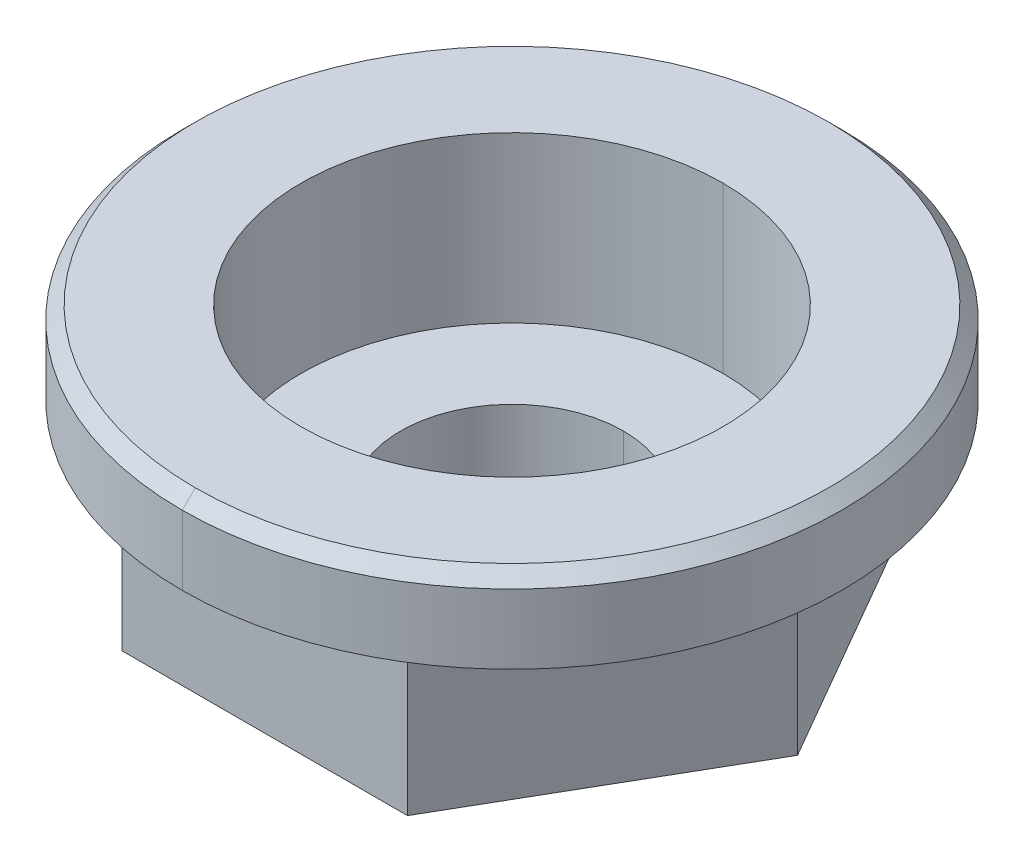
ISO-10303-21;
HEADER;
FILE_DESCRIPTION(('STEP AP214'),'2;1');
FILE_NAME('part.step','',(''),(''),'','','');
FILE_SCHEMA(('AUTOMOTIVE_DESIGN { 1 0 10303 214 1 1 1 1 }'));
ENDSEC;
DATA;
#1=APPLICATION_CONTEXT('core data for automotive mechanical design processes');
#2=APPLICATION_PROTOCOL_DEFINITION('international standard','automotive_design',2000,#1);
#3=PRODUCT_CONTEXT('',#1,'mechanical');
#4=PRODUCT('Part','Part','',(#3));
#5=PRODUCT_RELATED_PRODUCT_CATEGORY('part','',(#4));
#6=PRODUCT_DEFINITION_FORMATION('','',#4);
#7=PRODUCT_DEFINITION_CONTEXT('part definition',#1,'design');
#8=PRODUCT_DEFINITION('design','',#6,#7);
#9=PRODUCT_DEFINITION_SHAPE('','',#8);
#10=(LENGTH_UNIT() NAMED_UNIT(*) SI_UNIT(.MILLI.,.METRE.));
#11=(NAMED_UNIT(*) PLANE_ANGLE_UNIT() SI_UNIT($,.RADIAN.));
#12=(NAMED_UNIT(*) SI_UNIT($,.STERADIAN.) SOLID_ANGLE_UNIT());
#13=UNCERTAINTY_MEASURE_WITH_UNIT(LENGTH_MEASURE(1.E-05),#10,'distance_accuracy_value','');
#14=(GEOMETRIC_REPRESENTATION_CONTEXT(3) GLOBAL_UNCERTAINTY_ASSIGNED_CONTEXT((#13)) GLOBAL_UNIT_ASSIGNED_CONTEXT((#10,
#11,#12)) REPRESENTATION_CONTEXT('',''));
#15=CARTESIAN_POINT('',(0.,0.,0.));
#16=DIRECTION('',(0.,0.,1.));
#17=DIRECTION('',(1.,0.,0.));
#18=AXIS2_PLACEMENT_3D('',#15,#16,#17);
#19=CARTESIAN_POINT('',(0.,4.7625,0.));
#20=DIRECTION('',(0.,-1.,0.));
#21=DIRECTION('',(0.,0.,-1.));
#22=AXIS2_PLACEMENT_3D('',#19,#20,#21);
#23=CONICAL_SURFACE('',#22,6.1,0.78539816339745);
#24=DIRECTION('',(0.,-0.707106781186546,0.707106781186549));
#25=VECTOR('',#24,1.);
#26=CARTESIAN_POINT('',(0.,4.7625,6.1));
#27=LINE('',#26,#25);
#28=CARTESIAN_POINT('',(0.,4.7625,6.1));
#29=VERTEX_POINT('',#28);
#30=CARTESIAN_POINT('',(0.,4.5125,6.35));
#31=VERTEX_POINT('',#30);
#32=EDGE_CURVE('E220',#29,#31,#27,.T.);
#33=ORIENTED_EDGE('',*,*,#32,.F.);
#34=CARTESIAN_POINT('',(0.,4.7625,0.));
#35=DIRECTION('',(0.,1.,0.));
#36=DIRECTION('',(0.,0.,1.));
#37=AXIS2_PLACEMENT_3D('',#34,#35,#36);
#38=CIRCLE('',#37,6.1);
#39=CARTESIAN_POINT('',(0.,4.7625,-6.1));
#40=VERTEX_POINT('',#39);
#41=EDGE_CURVE('E179',#40,#29,#38,.T.);
#42=ORIENTED_EDGE('',*,*,#41,.F.);
#43=DIRECTION('',(0.,-0.707106781186546,-0.707106781186549));
#44=VECTOR('',#43,1.);
#45=CARTESIAN_POINT('',(0.,4.7625,-6.1));
#46=LINE('',#45,#44);
#47=CARTESIAN_POINT('',(0.,4.5125,-6.35));
#48=VERTEX_POINT('',#47);
#49=EDGE_CURVE('E166',#40,#48,#46,.T.);
#50=ORIENTED_EDGE('',*,*,#49,.T.);
#51=CARTESIAN_POINT('',(0.,4.5125,0.));
#52=DIRECTION('',(0.,-1.,0.));
#53=DIRECTION('',(0.,0.,1.));
#54=AXIS2_PLACEMENT_3D('',#51,#52,#53);
#55=CIRCLE('',#54,6.35);
#56=EDGE_CURVE('E176',#31,#48,#55,.T.);
#57=ORIENTED_EDGE('',*,*,#56,.F.);
#58=EDGE_LOOP('',(#33,#42,#50,#57));
#59=FACE_BOUND('',#58,.T.);
#60=ADVANCED_FACE('F16',(#59),#23,.T.);
#61=CARTESIAN_POINT('',(0.,0.,0.));
#62=DIRECTION('',(0.,1.,0.));
#63=DIRECTION('',(0.,0.,1.));
#64=AXIS2_PLACEMENT_3D('',#61,#62,#63);
#65=CYLINDRICAL_SURFACE('',#64,2.1463);
#66=DIRECTION('',(0.,1.,0.));
#67=VECTOR('',#66,1.);
#68=CARTESIAN_POINT('',(0.,0.,-2.1463));
#69=LINE('',#68,#67);
#70=CARTESIAN_POINT('',(0.,0.,-2.1463));
#71=VERTEX_POINT('',#70);
#72=CARTESIAN_POINT('',(0.,1.5875,-2.1463));
#73=VERTEX_POINT('',#72);
#74=EDGE_CURVE('E215',#71,#73,#69,.T.);
#75=ORIENTED_EDGE('',*,*,#74,.F.);
#76=CARTESIAN_POINT('',(0.,0.,0.));
#77=DIRECTION('',(0.,1.,0.));
#78=DIRECTION('',(0.,0.,1.));
#79=AXIS2_PLACEMENT_3D('',#76,#77,#78);
#80=CIRCLE('',#79,2.1463);
#81=CARTESIAN_POINT('',(0.,0.,2.1463));
#82=VERTEX_POINT('',#81);
#83=EDGE_CURVE('E205',#82,#71,#80,.T.);
#84=ORIENTED_EDGE('',*,*,#83,.F.);
#85=DIRECTION('',(0.,1.,0.));
#86=VECTOR('',#85,1.);
#87=CARTESIAN_POINT('',(0.,0.,2.1463));
#88=LINE('',#87,#86);
#89=CARTESIAN_POINT('',(0.,1.5875,2.1463));
#90=VERTEX_POINT('',#89);
#91=EDGE_CURVE('E198',#82,#90,#88,.T.);
#92=ORIENTED_EDGE('',*,*,#91,.T.);
#93=CARTESIAN_POINT('',(0.,1.5875,0.));
#94=DIRECTION('',(0.,1.,0.));
#95=DIRECTION('',(0.,0.,1.));
#96=AXIS2_PLACEMENT_3D('',#93,#94,#95);
#97=CIRCLE('',#96,2.1463);
#98=EDGE_CURVE('E11',#90,#73,#97,.T.);
#99=ORIENTED_EDGE('',*,*,#98,.T.);
#100=EDGE_LOOP('',(#75,#84,#92,#99));
#101=FACE_BOUND('',#100,.T.);
#102=ADVANCED_FACE('F329',(#101),#65,.F.);
#103=CARTESIAN_POINT('',(0.,1.5875,0.));
#104=DIRECTION('',(0.,1.,0.));
#105=DIRECTION('',(1.,0.,0.));
#106=AXIS2_PLACEMENT_3D('',#103,#104,#105);
#107=PLANE('',#106);
#108=ORIENTED_EDGE('',*,*,#98,.F.);
#109=CARTESIAN_POINT('',(0.,1.5875,0.));
#110=DIRECTION('',(0.,1.,0.));
#111=DIRECTION('',(0.,0.,1.));
#112=AXIS2_PLACEMENT_3D('',#109,#110,#111);
#113=CIRCLE('',#112,2.1463);
#114=EDGE_CURVE('E20',#73,#90,#113,.T.);
#115=ORIENTED_EDGE('',*,*,#114,.F.);
#116=EDGE_LOOP('',(#108,#115));
#117=FACE_BOUND('',#116,.T.);
#118=CARTESIAN_POINT('',(0.,1.5875,0.));
#119=DIRECTION('',(0.,-1.,0.));
#120=DIRECTION('',(0.,0.,1.));
#121=AXIS2_PLACEMENT_3D('',#118,#119,#120);
#122=CIRCLE('',#121,4.064);
#123=CARTESIAN_POINT('',(0.,1.5875,4.064));
#124=VERTEX_POINT('',#123);
#125=CARTESIAN_POINT('',(0.,1.5875,-4.064));
#126=VERTEX_POINT('',#125);
#127=EDGE_CURVE('E202',#124,#126,#122,.T.);
#128=ORIENTED_EDGE('',*,*,#127,.F.);
#129=CARTESIAN_POINT('',(0.,1.5875,0.));
#130=DIRECTION('',(0.,-1.,0.));
#131=DIRECTION('',(0.,0.,1.));
#132=AXIS2_PLACEMENT_3D('',#129,#130,#131);
#133=CIRCLE('',#132,4.064);
#134=EDGE_CURVE('E27',#126,#124,#133,.T.);
#135=ORIENTED_EDGE('',*,*,#134,.F.);
#136=EDGE_LOOP('',(#128,#135));
#137=FACE_BOUND('',#136,.T.);
#138=ADVANCED_FACE('F324',(#117,#137),#107,.T.);
#139=CARTESIAN_POINT('',(0.,-11.4947278349685,0.));
#140=DIRECTION('',(0.,1.,0.));
#141=DIRECTION('',(0.,0.,1.));
#142=AXIS2_PLACEMENT_3D('',#139,#140,#141);
#143=CYLINDRICAL_SURFACE('',#142,4.064);
#144=DIRECTION('',(0.,1.,0.));
#145=VECTOR('',#144,1.);
#146=CARTESIAN_POINT('',(0.,-11.4947278349685,-4.064));
#147=LINE('',#146,#145);
#148=CARTESIAN_POINT('',(0.,4.7625,-4.064));
#149=VERTEX_POINT('',#148);
#150=EDGE_CURVE('E211',#126,#149,#147,.T.);
#151=ORIENTED_EDGE('',*,*,#150,.F.);
#152=ORIENTED_EDGE('',*,*,#134,.T.);
#153=DIRECTION('',(0.,1.,0.));
#154=VECTOR('',#153,1.);
#155=CARTESIAN_POINT('',(0.,-11.4947278349685,4.064));
#156=LINE('',#155,#154);
#157=CARTESIAN_POINT('',(0.,4.7625,4.064));
#158=VERTEX_POINT('',#157);
#159=EDGE_CURVE('E151',#124,#158,#156,.T.);
#160=ORIENTED_EDGE('',*,*,#159,.T.);
#161=CARTESIAN_POINT('',(0.,4.7625,0.));
#162=DIRECTION('',(0.,1.,0.));
#163=DIRECTION('',(0.,0.,1.));
#164=AXIS2_PLACEMENT_3D('',#161,#162,#163);
#165=CIRCLE('',#164,4.064);
#166=EDGE_CURVE('E194',#158,#149,#165,.T.);
#167=ORIENTED_EDGE('',*,*,#166,.T.);
#168=EDGE_LOOP('',(#151,#152,#160,#167));
#169=FACE_BOUND('',#168,.T.);
#170=ADVANCED_FACE('F275',(#169),#143,.F.);
#171=CARTESIAN_POINT('',(0.,4.7625,0.));
#172=DIRECTION('',(0.,1.,0.));
#173=DIRECTION('',(1.,0.,0.));
#174=AXIS2_PLACEMENT_3D('',#171,#172,#173);
#175=PLANE('',#174);
#176=ORIENTED_EDGE('',*,*,#166,.F.);
#177=CARTESIAN_POINT('',(0.,4.7625,0.));
#178=DIRECTION('',(0.,1.,0.));
#179=DIRECTION('',(0.,0.,1.));
#180=AXIS2_PLACEMENT_3D('',#177,#178,#179);
#181=CIRCLE('',#180,4.064);
#182=EDGE_CURVE('E156',#149,#158,#181,.T.);
#183=ORIENTED_EDGE('',*,*,#182,.F.);
#184=EDGE_LOOP('',(#176,#183));
#185=FACE_BOUND('',#184,.T.);
#186=ORIENTED_EDGE('',*,*,#41,.T.);
#187=CARTESIAN_POINT('',(0.,4.7625,0.));
#188=DIRECTION('',(0.,1.,0.));
#189=DIRECTION('',(0.,0.,1.));
#190=AXIS2_PLACEMENT_3D('',#187,#188,#189);
#191=CIRCLE('',#190,6.1);
#192=EDGE_CURVE('E216',#29,#40,#191,.T.);
#193=ORIENTED_EDGE('',*,*,#192,.T.);
#194=EDGE_LOOP('',(#186,#193));
#195=FACE_BOUND('',#194,.T.);
#196=ADVANCED_FACE('F314',(#185,#195),#175,.T.);
#197=CARTESIAN_POINT('',(0.,4.7625,0.));
#198=DIRECTION('',(0.,-1.,0.));
#199=DIRECTION('',(0.,0.,-1.));
#200=AXIS2_PLACEMENT_3D('',#197,#198,#199);
#201=CYLINDRICAL_SURFACE('',#200,6.35);
#202=DIRECTION('',(0.,-1.,0.));
#203=VECTOR('',#202,1.);
#204=CARTESIAN_POINT('',(0.,4.7625,6.35));
#205=LINE('',#204,#203);
#206=CARTESIAN_POINT('',(0.,3.175,6.35));
#207=VERTEX_POINT('',#206);
#208=EDGE_CURVE('E155',#31,#207,#205,.T.);
#209=ORIENTED_EDGE('',*,*,#208,.F.);
#210=ORIENTED_EDGE('',*,*,#56,.T.);
#211=DIRECTION('',(0.,-1.,0.));
#212=VECTOR('',#211,1.);
#213=CARTESIAN_POINT('',(0.,4.7625,-6.35));
#214=LINE('',#213,#212);
#215=CARTESIAN_POINT('',(0.,3.175,-6.35));
#216=VERTEX_POINT('',#215);
#217=EDGE_CURVE('E175',#48,#216,#214,.T.);
#218=ORIENTED_EDGE('',*,*,#217,.T.);
#219=CARTESIAN_POINT('',(0.,3.175,0.));
#220=DIRECTION('',(0.,1.,0.));
#221=DIRECTION('',(0.,0.,1.));
#222=AXIS2_PLACEMENT_3D('',#219,#220,#221);
#223=CIRCLE('',#222,6.35);
#224=EDGE_CURVE('E180',#216,#207,#223,.T.);
#225=ORIENTED_EDGE('',*,*,#224,.T.);
#226=EDGE_LOOP('',(#209,#210,#218,#225));
#227=FACE_BOUND('',#226,.T.);
#228=ADVANCED_FACE('F302',(#227),#201,.T.);
#229=CARTESIAN_POINT('',(0.,3.175,0.));
#230=DIRECTION('',(0.,1.,0.));
#231=DIRECTION('',(1.,0.,0.));
#232=AXIS2_PLACEMENT_3D('',#229,#230,#231);
#233=PLANE('',#232);
#234=DIRECTION('',(1.,0.,0.));
#235=VECTOR('',#234,1.);
#236=CARTESIAN_POINT('',(-2.74963065701554,3.175,4.7625));
#237=LINE('',#236,#235);
#238=CARTESIAN_POINT('',(-2.74963065701554,3.175,4.7625));
#239=VERTEX_POINT('',#238);
#240=CARTESIAN_POINT('',(2.74963065701564,3.175,4.7625));
#241=VERTEX_POINT('',#240);
#242=EDGE_CURVE('E41',#239,#241,#237,.T.);
#243=ORIENTED_EDGE('',*,*,#242,.T.);
#244=DIRECTION('',(0.5,0.,-0.866025403784442));
#245=VECTOR('',#244,1.);
#246=CARTESIAN_POINT('',(2.74963065701564,3.175,4.7625));
#247=LINE('',#246,#245);
#248=CARTESIAN_POINT('',(5.49926131403117,3.175,0.));
#249=VERTEX_POINT('',#248);
#250=EDGE_CURVE('E164',#241,#249,#247,.T.);
#251=ORIENTED_EDGE('',*,*,#250,.T.);
#252=DIRECTION('',(-0.5,0.,-0.866025403784438));
#253=VECTOR('',#252,1.);
#254=CARTESIAN_POINT('',(5.49926131403117,3.175,0.));
#255=LINE('',#254,#253);
#256=CARTESIAN_POINT('',(2.74963065701558,3.175,-4.7625));
#257=VERTEX_POINT('',#256);
#258=EDGE_CURVE('E145',#249,#257,#255,.T.);
#259=ORIENTED_EDGE('',*,*,#258,.T.);
#260=DIRECTION('',(-1.,0.,0.));
#261=VECTOR('',#260,1.);
#262=CARTESIAN_POINT('',(2.74963065701558,3.175,-4.7625));
#263=LINE('',#262,#261);
#264=CARTESIAN_POINT('',(-2.7496306570156,3.175,-4.7625));
#265=VERTEX_POINT('',#264);
#266=EDGE_CURVE('E124',#257,#265,#263,.T.);
#267=ORIENTED_EDGE('',*,*,#266,.T.);
#268=DIRECTION('',(-0.5,0.,0.866025403784442));
#269=VECTOR('',#268,1.);
#270=CARTESIAN_POINT('',(-2.7496306570156,3.175,-4.7625));
#271=LINE('',#270,#269);
#272=CARTESIAN_POINT('',(-5.49926131403117,3.175,0.));
#273=VERTEX_POINT('',#272);
#274=EDGE_CURVE('E119',#265,#273,#271,.T.);
#275=ORIENTED_EDGE('',*,*,#274,.T.);
#276=DIRECTION('',(0.500000000000007,0.,0.866025403784435));
#277=VECTOR('',#276,1.);
#278=CARTESIAN_POINT('',(-5.49926131403117,3.175,0.));
#279=LINE('',#278,#277);
#280=EDGE_CURVE('E105',#273,#239,#279,.T.);
#281=ORIENTED_EDGE('',*,*,#280,.T.);
#282=EDGE_LOOP('',(#243,#251,#259,#267,#275,#281));
#283=FACE_BOUND('',#282,.T.);
#284=ORIENTED_EDGE('',*,*,#224,.F.);
#285=CARTESIAN_POINT('',(0.,3.175,0.));
#286=DIRECTION('',(0.,1.,0.));
#287=DIRECTION('',(0.,0.,1.));
#288=AXIS2_PLACEMENT_3D('',#285,#286,#287);
#289=CIRCLE('',#288,6.35);
#290=EDGE_CURVE('E236',#207,#216,#289,.T.);
#291=ORIENTED_EDGE('',*,*,#290,.F.);
#292=EDGE_LOOP('',(#284,#291));
#293=FACE_BOUND('',#292,.T.);
#294=ADVANCED_FACE('F120',(#283,#293),#233,.F.);
#295=CARTESIAN_POINT('',(0.,0.,0.));
#296=DIRECTION('',(0.,1.,0.));
#297=DIRECTION('',(1.,0.,0.));
#298=AXIS2_PLACEMENT_3D('',#295,#296,#297);
#299=PLANE('',#298);
#300=ORIENTED_EDGE('',*,*,#83,.T.);
#301=CARTESIAN_POINT('',(0.,0.,0.));
#302=DIRECTION('',(0.,1.,0.));
#303=DIRECTION('',(0.,0.,1.));
#304=AXIS2_PLACEMENT_3D('',#301,#302,#303);
#305=CIRCLE('',#304,2.1463);
#306=EDGE_CURVE('E170',#71,#82,#305,.T.);
#307=ORIENTED_EDGE('',*,*,#306,.T.);
#308=EDGE_LOOP('',(#300,#307));
#309=FACE_BOUND('',#308,.T.);
#310=DIRECTION('',(0.5,0.,-0.866025403784442));
#311=VECTOR('',#310,1.);
#312=CARTESIAN_POINT('',(2.74963065701564,0.,4.7625));
#313=LINE('',#312,#311);
#314=CARTESIAN_POINT('',(2.74963065701564,0.,4.7625));
#315=VERTEX_POINT('',#314);
#316=CARTESIAN_POINT('',(5.49926131403117,0.,0.));
#317=VERTEX_POINT('',#316);
#318=EDGE_CURVE('E165',#315,#317,#313,.T.);
#319=ORIENTED_EDGE('',*,*,#318,.F.);
#320=DIRECTION('',(1.,0.,0.));
#321=VECTOR('',#320,1.);
#322=CARTESIAN_POINT('',(-2.74963065701554,0.,4.7625));
#323=LINE('',#322,#321);
#324=CARTESIAN_POINT('',(-2.74963065701554,0.,4.7625));
#325=VERTEX_POINT('',#324);
#326=EDGE_CURVE('E115',#325,#315,#323,.T.);
#327=ORIENTED_EDGE('',*,*,#326,.F.);
#328=DIRECTION('',(0.500000000000007,0.,0.866025403784435));
#329=VECTOR('',#328,1.);
#330=CARTESIAN_POINT('',(-5.49926131403117,0.,0.));
#331=LINE('',#330,#329);
#332=CARTESIAN_POINT('',(-5.49926131403117,0.,0.));
#333=VERTEX_POINT('',#332);
#334=EDGE_CURVE('E129',#333,#325,#331,.T.);
#335=ORIENTED_EDGE('',*,*,#334,.F.);
#336=DIRECTION('',(-0.5,0.,0.866025403784442));
#337=VECTOR('',#336,1.);
#338=CARTESIAN_POINT('',(-2.7496306570156,0.,-4.7625));
#339=LINE('',#338,#337);
#340=CARTESIAN_POINT('',(-2.7496306570156,0.,-4.7625));
#341=VERTEX_POINT('',#340);
#342=EDGE_CURVE('E132',#341,#333,#339,.T.);
#343=ORIENTED_EDGE('',*,*,#342,.F.);
#344=DIRECTION('',(-1.,0.,0.));
#345=VECTOR('',#344,1.);
#346=CARTESIAN_POINT('',(2.74963065701558,0.,-4.7625));
#347=LINE('',#346,#345);
#348=CARTESIAN_POINT('',(2.74963065701558,0.,-4.7625));
#349=VERTEX_POINT('',#348);
#350=EDGE_CURVE('E181',#349,#341,#347,.T.);
#351=ORIENTED_EDGE('',*,*,#350,.F.);
#352=DIRECTION('',(-0.5,0.,-0.866025403784438));
#353=VECTOR('',#352,1.);
#354=CARTESIAN_POINT('',(5.49926131403117,0.,0.));
#355=LINE('',#354,#353);
#356=EDGE_CURVE('E146',#317,#349,#355,.T.);
#357=ORIENTED_EDGE('',*,*,#356,.F.);
#358=EDGE_LOOP('',(#319,#327,#335,#343,#351,#357));
#359=FACE_BOUND('',#358,.T.);
#360=ADVANCED_FACE('F336',(#309,#359),#299,.F.);
#361=CARTESIAN_POINT('',(-2.74963065701554,3.175,4.7625));
#362=DIRECTION('',(0.,0.,-1.));
#363=DIRECTION('',(-1.,0.,0.));
#364=AXIS2_PLACEMENT_3D('',#361,#362,#363);
#365=PLANE('',#364);
#366=ORIENTED_EDGE('',*,*,#326,.T.);
#367=DIRECTION('',(0.,-1.,0.));
#368=VECTOR('',#367,1.);
#369=CARTESIAN_POINT('',(2.74963065701564,3.175,4.7625));
#370=LINE('',#369,#368);
#371=EDGE_CURVE('E150',#241,#315,#370,.T.);
#372=ORIENTED_EDGE('',*,*,#371,.F.);
#373=ORIENTED_EDGE('',*,*,#242,.F.);
#374=DIRECTION('',(0.,-1.,0.));
#375=VECTOR('',#374,1.);
#376=CARTESIAN_POINT('',(-2.74963065701554,3.175,4.7625));
#377=LINE('',#376,#375);
#378=EDGE_CURVE('E112',#239,#325,#377,.T.);
#379=ORIENTED_EDGE('',*,*,#378,.T.);
#380=EDGE_LOOP('',(#366,#372,#373,#379));
#381=FACE_BOUND('',#380,.T.);
#382=ADVANCED_FACE('F341',(#381),#365,.F.);
#383=CARTESIAN_POINT('',(-5.49926131403117,3.175,0.));
#384=DIRECTION('',(0.866025403784435,0.,-0.500000000000007));
#385=DIRECTION('',(0.,-1.,0.));
#386=AXIS2_PLACEMENT_3D('',#383,#384,#385);
#387=PLANE('',#386);
#388=ORIENTED_EDGE('',*,*,#334,.T.);
#389=ORIENTED_EDGE('',*,*,#378,.F.);
#390=ORIENTED_EDGE('',*,*,#280,.F.);
#391=DIRECTION('',(0.,-1.,0.));
#392=VECTOR('',#391,1.);
#393=CARTESIAN_POINT('',(-5.49926131403117,3.175,0.));
#394=LINE('',#393,#392);
#395=EDGE_CURVE('E110',#273,#333,#394,.T.);
#396=ORIENTED_EDGE('',*,*,#395,.T.);
#397=EDGE_LOOP('',(#388,#389,#390,#396));
#398=FACE_BOUND('',#397,.T.);
#399=ADVANCED_FACE('F108',(#398),#387,.F.);
#400=CARTESIAN_POINT('',(-2.7496306570156,3.175,-4.7625));
#401=DIRECTION('',(0.866025403784442,0.,0.5));
#402=DIRECTION('',(0.,-1.,0.));
#403=AXIS2_PLACEMENT_3D('',#400,#401,#402);
#404=PLANE('',#403);
#405=ORIENTED_EDGE('',*,*,#342,.T.);
#406=ORIENTED_EDGE('',*,*,#395,.F.);
#407=ORIENTED_EDGE('',*,*,#274,.F.);
#408=DIRECTION('',(0.,-1.,0.));
#409=VECTOR('',#408,1.);
#410=CARTESIAN_POINT('',(-2.7496306570156,3.175,-4.7625));
#411=LINE('',#410,#409);
#412=EDGE_CURVE('E185',#265,#341,#411,.T.);
#413=ORIENTED_EDGE('',*,*,#412,.T.);
#414=EDGE_LOOP('',(#405,#406,#407,#413));
#415=FACE_BOUND('',#414,.T.);
#416=ADVANCED_FACE('F18',(#415),#404,.F.);
#417=CARTESIAN_POINT('',(2.74963065701558,3.175,-4.7625));
#418=DIRECTION('',(0.,0.,1.));
#419=DIRECTION('',(1.,0.,0.));
#420=AXIS2_PLACEMENT_3D('',#417,#418,#419);
#421=PLANE('',#420);
#422=ORIENTED_EDGE('',*,*,#350,.T.);
#423=ORIENTED_EDGE('',*,*,#412,.F.);
#424=ORIENTED_EDGE('',*,*,#266,.F.);
#425=DIRECTION('',(0.,-1.,0.));
#426=VECTOR('',#425,1.);
#427=CARTESIAN_POINT('',(2.74963065701558,3.175,-4.7625));
#428=LINE('',#427,#426);
#429=EDGE_CURVE('E141',#257,#349,#428,.T.);
#430=ORIENTED_EDGE('',*,*,#429,.T.);
#431=EDGE_LOOP('',(#422,#423,#424,#430));
#432=FACE_BOUND('',#431,.T.);
#433=ADVANCED_FACE('F356',(#432),#421,.F.);
#434=CARTESIAN_POINT('',(5.49926131403117,3.175,0.));
#435=DIRECTION('',(-0.866025403784438,0.,0.5));
#436=DIRECTION('',(0.,1.,0.));
#437=AXIS2_PLACEMENT_3D('',#434,#435,#436);
#438=PLANE('',#437);
#439=ORIENTED_EDGE('',*,*,#356,.T.);
#440=ORIENTED_EDGE('',*,*,#429,.F.);
#441=ORIENTED_EDGE('',*,*,#258,.F.);
#442=DIRECTION('',(0.,-1.,0.));
#443=VECTOR('',#442,1.);
#444=CARTESIAN_POINT('',(5.49926131403117,3.175,0.));
#445=LINE('',#444,#443);
#446=EDGE_CURVE('E160',#249,#317,#445,.T.);
#447=ORIENTED_EDGE('',*,*,#446,.T.);
#448=EDGE_LOOP('',(#439,#440,#441,#447));
#449=FACE_BOUND('',#448,.T.);
#450=ADVANCED_FACE('F360',(#449),#438,.F.);
#451=CARTESIAN_POINT('',(2.74963065701564,3.175,4.7625));
#452=DIRECTION('',(-0.866025403784442,0.,-0.5));
#453=DIRECTION('',(-0.5,0.,0.866025403784442));
#454=AXIS2_PLACEMENT_3D('',#451,#452,#453);
#455=PLANE('',#454);
#456=ORIENTED_EDGE('',*,*,#318,.T.);
#457=ORIENTED_EDGE('',*,*,#446,.F.);
#458=ORIENTED_EDGE('',*,*,#250,.F.);
#459=ORIENTED_EDGE('',*,*,#371,.T.);
#460=EDGE_LOOP('',(#456,#457,#458,#459));
#461=FACE_BOUND('',#460,.T.);
#462=ADVANCED_FACE('F353',(#461),#455,.F.);
#463=CARTESIAN_POINT('',(0.,4.7625,0.));
#464=DIRECTION('',(0.,-1.,0.));
#465=DIRECTION('',(0.,0.,-1.));
#466=AXIS2_PLACEMENT_3D('',#463,#464,#465);
#467=CYLINDRICAL_SURFACE('',#466,6.35);
#468=CARTESIAN_POINT('',(0.,4.5125,0.));
#469=DIRECTION('',(0.,-1.,0.));
#470=DIRECTION('',(0.,0.,1.));
#471=AXIS2_PLACEMENT_3D('',#468,#469,#470);
#472=CIRCLE('',#471,6.35);
#473=EDGE_CURVE('E171',#48,#31,#472,.T.);
#474=ORIENTED_EDGE('',*,*,#473,.T.);
#475=ORIENTED_EDGE('',*,*,#208,.T.);
#476=ORIENTED_EDGE('',*,*,#290,.T.);
#477=ORIENTED_EDGE('',*,*,#217,.F.);
#478=EDGE_LOOP('',(#474,#475,#476,#477));
#479=FACE_BOUND('',#478,.T.);
#480=ADVANCED_FACE('F305',(#479),#467,.T.);
#481=CARTESIAN_POINT('',(0.,-11.4947278349685,0.));
#482=DIRECTION('',(0.,1.,0.));
#483=DIRECTION('',(0.,0.,1.));
#484=AXIS2_PLACEMENT_3D('',#481,#482,#483);
#485=CYLINDRICAL_SURFACE('',#484,4.064);
#486=ORIENTED_EDGE('',*,*,#127,.T.);
#487=ORIENTED_EDGE('',*,*,#150,.T.);
#488=ORIENTED_EDGE('',*,*,#182,.T.);
#489=ORIENTED_EDGE('',*,*,#159,.F.);
#490=EDGE_LOOP('',(#486,#487,#488,#489));
#491=FACE_BOUND('',#490,.T.);
#492=ADVANCED_FACE('F266',(#491),#485,.F.);
#493=CARTESIAN_POINT('',(0.,0.,0.));
#494=DIRECTION('',(0.,1.,0.));
#495=DIRECTION('',(0.,0.,1.));
#496=AXIS2_PLACEMENT_3D('',#493,#494,#495);
#497=CYLINDRICAL_SURFACE('',#496,2.1463);
#498=ORIENTED_EDGE('',*,*,#306,.F.);
#499=ORIENTED_EDGE('',*,*,#74,.T.);
#500=ORIENTED_EDGE('',*,*,#114,.T.);
#501=ORIENTED_EDGE('',*,*,#91,.F.);
#502=EDGE_LOOP('',(#498,#499,#500,#501));
#503=FACE_BOUND('',#502,.T.);
#504=ADVANCED_FACE('F375',(#503),#497,.F.);
#505=CARTESIAN_POINT('',(0.,4.7625,0.));
#506=DIRECTION('',(0.,-1.,0.));
#507=DIRECTION('',(0.,0.,-1.));
#508=AXIS2_PLACEMENT_3D('',#505,#506,#507);
#509=CONICAL_SURFACE('',#508,6.1,0.78539816339745);
#510=ORIENTED_EDGE('',*,*,#192,.F.);
#511=ORIENTED_EDGE('',*,*,#32,.T.);
#512=ORIENTED_EDGE('',*,*,#473,.F.);
#513=ORIENTED_EDGE('',*,*,#49,.F.);
#514=EDGE_LOOP('',(#510,#511,#512,#513));
#515=FACE_BOUND('',#514,.T.);
#516=ADVANCED_FACE('F311',(#515),#509,.T.);
#517=CLOSED_SHELL('',(#60,#102,#138,#170,#196,#228,#294,#360,#382,#399,#416,#433,#450,#462,#480,
#492,#504,#516));
#518=MANIFOLD_SOLID_BREP('B1',#517);
#519=ADVANCED_BREP_SHAPE_REPRESENTATION('',(#18,#518),#14);
#520=SHAPE_DEFINITION_REPRESENTATION(#9,#519);
ENDSEC;
END-ISO-10303-21;
